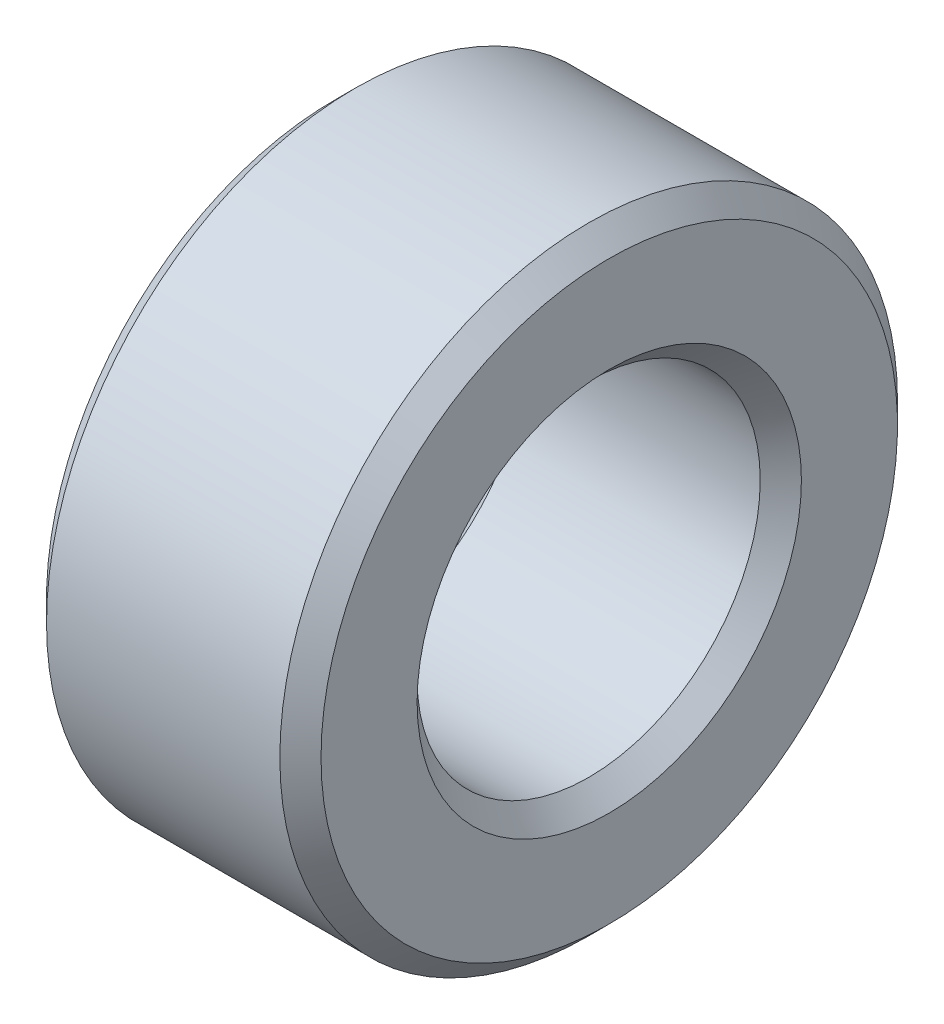
ISO-10303-21;
HEADER;
FILE_DESCRIPTION(('STEP AP214'),'2;1');
FILE_NAME('part.step','',(''),(''),'','','');
FILE_SCHEMA(('AUTOMOTIVE_DESIGN { 1 0 10303 214 1 1 1 1 }'));
ENDSEC;
DATA;
#1=APPLICATION_CONTEXT('core data for automotive mechanical design processes');
#2=APPLICATION_PROTOCOL_DEFINITION('international standard','automotive_design',2000,#1);
#3=PRODUCT_CONTEXT('',#1,'mechanical');
#4=PRODUCT('Part','Part','',(#3));
#5=PRODUCT_RELATED_PRODUCT_CATEGORY('part','',(#4));
#6=PRODUCT_DEFINITION_FORMATION('','',#4);
#7=PRODUCT_DEFINITION_CONTEXT('part definition',#1,'design');
#8=PRODUCT_DEFINITION('design','',#6,#7);
#9=PRODUCT_DEFINITION_SHAPE('','',#8);
#10=(LENGTH_UNIT() NAMED_UNIT(*) SI_UNIT(.MILLI.,.METRE.));
#11=(NAMED_UNIT(*) PLANE_ANGLE_UNIT() SI_UNIT($,.RADIAN.));
#12=(NAMED_UNIT(*) SI_UNIT($,.STERADIAN.) SOLID_ANGLE_UNIT());
#13=UNCERTAINTY_MEASURE_WITH_UNIT(LENGTH_MEASURE(1.E-05),#10,'distance_accuracy_value','');
#14=(GEOMETRIC_REPRESENTATION_CONTEXT(3) GLOBAL_UNCERTAINTY_ASSIGNED_CONTEXT((#13)) GLOBAL_UNIT_ASSIGNED_CONTEXT((#10,
#11,#12)) REPRESENTATION_CONTEXT('',''));
#15=CARTESIAN_POINT('',(0.,0.,0.));
#16=DIRECTION('',(0.,0.,1.));
#17=DIRECTION('',(1.,0.,0.));
#18=AXIS2_PLACEMENT_3D('',#15,#16,#17);
#19=CARTESIAN_POINT('',(0.,4.49999999999999,0.));
#20=DIRECTION('',(1.,0.,0.));
#21=DIRECTION('',(0.,0.,-1.));
#22=AXIS2_PLACEMENT_3D('',#19,#20,#21);
#23=PLANE('',#22);
#24=CARTESIAN_POINT('',(0.,0.,0.));
#25=DIRECTION('',(1.,0.,0.));
#26=DIRECTION('',(0.,0.,-1.));
#27=AXIS2_PLACEMENT_3D('',#24,#25,#26);
#28=CIRCLE('',#27,4.2);
#29=CARTESIAN_POINT('',(0.,0.,-4.2));
#30=VERTEX_POINT('',#29);
#31=EDGE_CURVE('E10',#30,#30,#28,.F.);
#32=ORIENTED_EDGE('',*,*,#31,.T.);
#33=EDGE_LOOP('',(#32));
#34=FACE_BOUND('',#33,.T.);
#35=CARTESIAN_POINT('',(0.,0.,0.));
#36=DIRECTION('',(1.,0.,0.));
#37=DIRECTION('',(0.,0.,-1.));
#38=AXIS2_PLACEMENT_3D('',#35,#36,#37);
#39=CIRCLE('',#38,2.8);
#40=CARTESIAN_POINT('',(0.,0.,2.8));
#41=VERTEX_POINT('',#40);
#42=EDGE_CURVE('E33',#41,#41,#39,.T.);
#43=ORIENTED_EDGE('',*,*,#42,.T.);
#44=EDGE_LOOP('',(#43));
#45=FACE_BOUND('',#44,.T.);
#46=ADVANCED_FACE('F27',(#34,#45),#23,.F.);
#47=CARTESIAN_POINT('',(0.,0.,0.));
#48=DIRECTION('',(-1.,0.,0.));
#49=DIRECTION('',(0.,0.,1.));
#50=AXIS2_PLACEMENT_3D('',#47,#48,#49);
#51=CYLINDRICAL_SURFACE('',#50,2.5);
#52=CARTESIAN_POINT('',(3.7,0.,0.));
#53=DIRECTION('',(-1.,0.,0.));
#54=DIRECTION('',(0.,0.,1.));
#55=AXIS2_PLACEMENT_3D('',#52,#53,#54);
#56=CIRCLE('',#55,2.5);
#57=CARTESIAN_POINT('',(3.7,0.,2.5));
#58=VERTEX_POINT('',#57);
#59=EDGE_CURVE('E46',#58,#58,#56,.F.);
#60=ORIENTED_EDGE('',*,*,#59,.T.);
#61=EDGE_LOOP('',(#60));
#62=FACE_BOUND('',#61,.T.);
#63=CARTESIAN_POINT('',(0.3,0.,0.));
#64=DIRECTION('',(1.,0.,0.));
#65=DIRECTION('',(0.,0.,-1.));
#66=AXIS2_PLACEMENT_3D('',#63,#64,#65);
#67=CIRCLE('',#66,2.5);
#68=CARTESIAN_POINT('',(0.3,0.,2.5));
#69=VERTEX_POINT('',#68);
#70=EDGE_CURVE('E49',#69,#69,#67,.F.);
#71=ORIENTED_EDGE('',*,*,#70,.T.);
#72=EDGE_LOOP('',(#71));
#73=FACE_BOUND('',#72,.T.);
#74=ADVANCED_FACE('F85',(#62,#73),#51,.F.);
#75=CARTESIAN_POINT('',(4.,2.5,0.));
#76=DIRECTION('',(-1.,0.,0.));
#77=DIRECTION('',(0.,0.,1.));
#78=AXIS2_PLACEMENT_3D('',#75,#76,#77);
#79=PLANE('',#78);
#80=CARTESIAN_POINT('',(4.,0.,0.));
#81=DIRECTION('',(-1.,0.,0.));
#82=DIRECTION('',(0.,0.,1.));
#83=AXIS2_PLACEMENT_3D('',#80,#81,#82);
#84=CIRCLE('',#83,2.8);
#85=CARTESIAN_POINT('',(4.,0.,2.8));
#86=VERTEX_POINT('',#85);
#87=EDGE_CURVE('E52',#86,#86,#84,.T.);
#88=ORIENTED_EDGE('',*,*,#87,.T.);
#89=EDGE_LOOP('',(#88));
#90=FACE_BOUND('',#89,.T.);
#91=CARTESIAN_POINT('',(4.,0.,0.));
#92=DIRECTION('',(-1.,0.,0.));
#93=DIRECTION('',(0.,0.,1.));
#94=AXIS2_PLACEMENT_3D('',#91,#92,#93);
#95=CIRCLE('',#94,4.19999999999999);
#96=CARTESIAN_POINT('',(4.,0.,4.19999999999999));
#97=VERTEX_POINT('',#96);
#98=EDGE_CURVE('E55',#97,#97,#95,.F.);
#99=ORIENTED_EDGE('',*,*,#98,.T.);
#100=EDGE_LOOP('',(#99));
#101=FACE_BOUND('',#100,.T.);
#102=ADVANCED_FACE('F59',(#90,#101),#79,.F.);
#103=CARTESIAN_POINT('',(0.,0.,0.));
#104=DIRECTION('',(-1.,0.,0.));
#105=DIRECTION('',(0.,0.,1.));
#106=AXIS2_PLACEMENT_3D('',#103,#104,#105);
#107=CYLINDRICAL_SURFACE('',#106,4.49999999999999);
#108=CARTESIAN_POINT('',(3.7,0.,0.));
#109=DIRECTION('',(-1.,0.,0.));
#110=DIRECTION('',(0.,0.,1.));
#111=AXIS2_PLACEMENT_3D('',#108,#109,#110);
#112=CIRCLE('',#111,4.49999999999999);
#113=CARTESIAN_POINT('',(3.7,0.,4.49999999999999));
#114=VERTEX_POINT('',#113);
#115=EDGE_CURVE('E37',#114,#114,#112,.T.);
#116=CARTESIAN_POINT('',(0.300000000000002,0.,0.));
#117=DIRECTION('',(1.,0.,0.));
#118=DIRECTION('',(0.,0.,-1.));
#119=AXIS2_PLACEMENT_3D('',#116,#117,#118);
#120=CIRCLE('',#119,4.49999999999999);
#121=CARTESIAN_POINT('',(0.300000000000002,0.,4.49999999999999));
#122=VERTEX_POINT('',#121);
#123=EDGE_CURVE('E41',#122,#122,#120,.T.);
#124=CARTESIAN_POINT('',(3.7,0.,4.49999999999999));
#125=CARTESIAN_POINT('',(3.66458333333334,0.,4.49999999999999));
#126=CARTESIAN_POINT('',(3.62916666666667,0.,4.49999999999999));
#127=CARTESIAN_POINT('',(3.55833333333334,0.,4.49999999999999));
#128=CARTESIAN_POINT('',(3.52291666666667,0.,4.49999999999999));
#129=CARTESIAN_POINT('',(3.45208333333334,0.,4.49999999999999));
#130=CARTESIAN_POINT('',(3.41666666666667,0.,4.49999999999999));
#131=CARTESIAN_POINT('',(3.34583333333334,0.,4.49999999999999));
#132=CARTESIAN_POINT('',(3.31041666666667,0.,4.49999999999999));
#133=CARTESIAN_POINT('',(3.23958333333334,0.,4.49999999999999));
#134=CARTESIAN_POINT('',(3.20416666666667,0.,4.49999999999999));
#135=CARTESIAN_POINT('',(3.13333333333334,0.,4.49999999999999));
#136=CARTESIAN_POINT('',(3.09791666666667,0.,4.49999999999999));
#137=CARTESIAN_POINT('',(3.02708333333334,0.,4.49999999999999));
#138=CARTESIAN_POINT('',(2.99166666666667,0.,4.49999999999999));
#139=CARTESIAN_POINT('',(2.92083333333334,0.,4.49999999999999));
#140=CARTESIAN_POINT('',(2.88541666666667,0.,4.49999999999999));
#141=CARTESIAN_POINT('',(2.81458333333334,0.,4.49999999999999));
#142=CARTESIAN_POINT('',(2.77916666666667,0.,4.49999999999999));
#143=CARTESIAN_POINT('',(2.70833333333334,0.,4.49999999999999));
#144=CARTESIAN_POINT('',(2.67291666666667,0.,4.49999999999999));
#145=CARTESIAN_POINT('',(2.60208333333334,0.,4.49999999999999));
#146=CARTESIAN_POINT('',(2.56666666666667,0.,4.49999999999999));
#147=CARTESIAN_POINT('',(2.49583333333334,0.,4.49999999999999));
#148=CARTESIAN_POINT('',(2.46041666666667,0.,4.49999999999999));
#149=CARTESIAN_POINT('',(2.38958333333334,0.,4.49999999999999));
#150=CARTESIAN_POINT('',(2.35416666666667,0.,4.49999999999999));
#151=CARTESIAN_POINT('',(2.28333333333334,0.,4.49999999999999));
#152=CARTESIAN_POINT('',(2.24791666666667,0.,4.49999999999999));
#153=CARTESIAN_POINT('',(2.17708333333334,0.,4.49999999999999));
#154=CARTESIAN_POINT('',(2.14166666666667,0.,4.49999999999999));
#155=CARTESIAN_POINT('',(2.07083333333334,0.,4.49999999999999));
#156=CARTESIAN_POINT('',(2.03541666666667,0.,4.49999999999999));
#157=CARTESIAN_POINT('',(1.96458333333334,0.,4.49999999999999));
#158=CARTESIAN_POINT('',(1.92916666666667,0.,4.49999999999999));
#159=CARTESIAN_POINT('',(1.85833333333334,0.,4.49999999999999));
#160=CARTESIAN_POINT('',(1.82291666666667,0.,4.49999999999999));
#161=CARTESIAN_POINT('',(1.75208333333334,0.,4.49999999999999));
#162=CARTESIAN_POINT('',(1.71666666666667,0.,4.49999999999999));
#163=CARTESIAN_POINT('',(1.64583333333334,0.,4.49999999999999));
#164=CARTESIAN_POINT('',(1.61041666666667,0.,4.49999999999999));
#165=CARTESIAN_POINT('',(1.53958333333334,0.,4.49999999999999));
#166=CARTESIAN_POINT('',(1.50416666666667,0.,4.49999999999999));
#167=CARTESIAN_POINT('',(1.43333333333334,0.,4.49999999999999));
#168=CARTESIAN_POINT('',(1.39791666666667,0.,4.49999999999999));
#169=CARTESIAN_POINT('',(1.32708333333334,0.,4.49999999999999));
#170=CARTESIAN_POINT('',(1.29166666666667,0.,4.49999999999999));
#171=CARTESIAN_POINT('',(1.22083333333334,0.,4.49999999999999));
#172=CARTESIAN_POINT('',(1.18541666666667,0.,4.49999999999999));
#173=CARTESIAN_POINT('',(1.11458333333334,0.,4.49999999999999));
#174=CARTESIAN_POINT('',(1.07916666666667,0.,4.49999999999999));
#175=CARTESIAN_POINT('',(1.00833333333334,0.,4.49999999999999));
#176=CARTESIAN_POINT('',(0.972916666666669,0.,4.49999999999999));
#177=CARTESIAN_POINT('',(0.902083333333336,0.,4.49999999999999));
#178=CARTESIAN_POINT('',(0.866666666666669,0.,4.49999999999999));
#179=CARTESIAN_POINT('',(0.795833333333336,0.,4.49999999999999));
#180=CARTESIAN_POINT('',(0.760416666666669,0.,4.49999999999999));
#181=CARTESIAN_POINT('',(0.689583333333336,0.,4.49999999999999));
#182=CARTESIAN_POINT('',(0.654166666666669,0.,4.49999999999999));
#183=CARTESIAN_POINT('',(0.583333333333336,0.,4.49999999999999));
#184=CARTESIAN_POINT('',(0.547916666666669,0.,4.49999999999999));
#185=CARTESIAN_POINT('',(0.477083333333336,0.,4.49999999999999));
#186=CARTESIAN_POINT('',(0.441666666666669,0.,4.49999999999999));
#187=CARTESIAN_POINT('',(0.370833333333336,0.,4.49999999999999));
#188=CARTESIAN_POINT('',(0.335416666666669,0.,4.49999999999999));
#189=CARTESIAN_POINT('',(0.300000000000003,0.,4.49999999999999));
#190=B_SPLINE_CURVE_WITH_KNOTS('',3,(#124,#125,#126,#127,#128,#129,#130,#131,#132,#133,#134,
#135,#136,#137,#138,#139,#140,#141,#142,#143,#144,#145,#146,#147,#148,#149,#150,#151,#152,#153,
#154,#155,#156,#157,#158,#159,#160,#161,#162,#163,#164,#165,#166,#167,#168,#169,#170,#171,#172,
#173,#174,#175,#176,#177,#178,#179,#180,#181,#182,#183,#184,#185,#186,#187,#188,#189),
.UNSPECIFIED.,.F.,.F.,(4,2,2,2,2,2,2,2,2,2,2,2,2,2,2,2,2,2,2,2,2,2,2,2,2,2,2,2,2,2,2,2,4),(0.,
0.10625,0.2125,0.31875,0.425,0.53125,0.6375,0.74375,0.85,0.95625,1.0625,1.16875,1.275,1.38125,
1.4875,1.59375,1.7,1.80625,1.9125,2.01875,2.125,2.23125,2.3375,2.44375,2.55,2.65625,2.7625,
2.86875,2.975,3.08125,3.1875,3.29375,3.4),.UNSPECIFIED.);
#191=EDGE_CURVE('BSEAM69',#114,#122,#190,.T.);
#192=ORIENTED_EDGE('',*,*,#115,.T.);
#193=ORIENTED_EDGE('',*,*,#123,.T.);
#194=ORIENTED_EDGE('',*,*,#191,.T.);
#195=ORIENTED_EDGE('',*,*,#191,.F.);
#196=EDGE_LOOP('',(#192,#194,#193,#195));
#197=FACE_BOUND('',#196,.T.);
#198=ADVANCED_FACE('F69',(#197),#107,.T.);
#199=CARTESIAN_POINT('',(4.,0.,0.));
#200=DIRECTION('',(1.,0.,0.));
#201=DIRECTION('',(0.,0.,-1.));
#202=AXIS2_PLACEMENT_3D('',#199,#200,#201);
#203=CONICAL_SURFACE('',#202,2.8,0.785398163397448);
#204=ORIENTED_EDGE('',*,*,#59,.F.);
#205=EDGE_LOOP('',(#204));
#206=FACE_BOUND('',#205,.T.);
#207=ORIENTED_EDGE('',*,*,#87,.F.);
#208=EDGE_LOOP('',(#207));
#209=FACE_BOUND('',#208,.T.);
#210=ADVANCED_FACE('F65',(#206,#209),#203,.F.);
#211=CARTESIAN_POINT('',(3.7,0.,0.));
#212=DIRECTION('',(-1.,0.,0.));
#213=DIRECTION('',(0.,0.,1.));
#214=AXIS2_PLACEMENT_3D('',#211,#212,#213);
#215=CONICAL_SURFACE('',#214,4.49999999999999,0.78539816339745);
#216=CARTESIAN_POINT('',(4.,0.,4.19999999999999));
#217=CARTESIAN_POINT('',(3.996875,0.,4.20312499999999));
#218=CARTESIAN_POINT('',(3.99375,0.,4.20624999999999));
#219=CARTESIAN_POINT('',(3.9875,0.,4.21249999999999));
#220=CARTESIAN_POINT('',(3.984375,0.,4.21562499999999));
#221=CARTESIAN_POINT('',(3.978125,0.,4.22187499999999));
#222=CARTESIAN_POINT('',(3.975,0.,4.22499999999999));
#223=CARTESIAN_POINT('',(3.96875,0.,4.23124999999999));
#224=CARTESIAN_POINT('',(3.965625,0.,4.23437499999999));
#225=CARTESIAN_POINT('',(3.959375,0.,4.24062499999999));
#226=CARTESIAN_POINT('',(3.95625,0.,4.24374999999999));
#227=CARTESIAN_POINT('',(3.95,0.,4.24999999999999));
#228=CARTESIAN_POINT('',(3.946875,0.,4.25312499999999));
#229=CARTESIAN_POINT('',(3.940625,0.,4.25937499999999));
#230=CARTESIAN_POINT('',(3.9375,0.,4.26249999999999));
#231=CARTESIAN_POINT('',(3.93125,0.,4.26874999999999));
#232=CARTESIAN_POINT('',(3.928125,0.,4.27187499999999));
#233=CARTESIAN_POINT('',(3.921875,0.,4.27812499999999));
#234=CARTESIAN_POINT('',(3.91875,0.,4.28124999999999));
#235=CARTESIAN_POINT('',(3.9125,0.,4.28749999999999));
#236=CARTESIAN_POINT('',(3.909375,0.,4.29062499999999));
#237=CARTESIAN_POINT('',(3.903125,0.,4.29687499999999));
#238=CARTESIAN_POINT('',(3.9,0.,4.29999999999999));
#239=CARTESIAN_POINT('',(3.89375,0.,4.30624999999999));
#240=CARTESIAN_POINT('',(3.890625,0.,4.30937499999999));
#241=CARTESIAN_POINT('',(3.884375,0.,4.31562499999999));
#242=CARTESIAN_POINT('',(3.88125,0.,4.31874999999999));
#243=CARTESIAN_POINT('',(3.875,0.,4.32499999999999));
#244=CARTESIAN_POINT('',(3.871875,0.,4.32812499999999));
#245=CARTESIAN_POINT('',(3.865625,0.,4.33437499999999));
#246=CARTESIAN_POINT('',(3.8625,0.,4.33749999999999));
#247=CARTESIAN_POINT('',(3.85625,0.,4.34374999999999));
#248=CARTESIAN_POINT('',(3.853125,0.,4.34687499999999));
#249=CARTESIAN_POINT('',(3.846875,0.,4.35312499999999));
#250=CARTESIAN_POINT('',(3.84375,0.,4.35624999999999));
#251=CARTESIAN_POINT('',(3.8375,0.,4.36249999999999));
#252=CARTESIAN_POINT('',(3.834375,0.,4.36562499999999));
#253=CARTESIAN_POINT('',(3.828125,0.,4.37187499999999));
#254=CARTESIAN_POINT('',(3.825,0.,4.37499999999999));
#255=CARTESIAN_POINT('',(3.81875,0.,4.38124999999999));
#256=CARTESIAN_POINT('',(3.815625,0.,4.38437499999999));
#257=CARTESIAN_POINT('',(3.809375,0.,4.39062499999999));
#258=CARTESIAN_POINT('',(3.80625,0.,4.39374999999999));
#259=CARTESIAN_POINT('',(3.8,0.,4.39999999999999));
#260=CARTESIAN_POINT('',(3.796875,0.,4.40312499999999));
#261=CARTESIAN_POINT('',(3.790625,0.,4.40937499999999));
#262=CARTESIAN_POINT('',(3.7875,0.,4.41249999999999));
#263=CARTESIAN_POINT('',(3.78125,0.,4.41874999999999));
#264=CARTESIAN_POINT('',(3.778125,0.,4.42187499999999));
#265=CARTESIAN_POINT('',(3.771875,0.,4.42812499999999));
#266=CARTESIAN_POINT('',(3.76875,0.,4.43124999999999));
#267=CARTESIAN_POINT('',(3.7625,0.,4.43749999999999));
#268=CARTESIAN_POINT('',(3.759375,0.,4.44062499999999));
#269=CARTESIAN_POINT('',(3.753125,0.,4.44687499999999));
#270=CARTESIAN_POINT('',(3.75,0.,4.44999999999999));
#271=CARTESIAN_POINT('',(3.74375,0.,4.45624999999999));
#272=CARTESIAN_POINT('',(3.740625,0.,4.45937499999999));
#273=CARTESIAN_POINT('',(3.734375,0.,4.46562499999999));
#274=CARTESIAN_POINT('',(3.73125,0.,4.46874999999999));
#275=CARTESIAN_POINT('',(3.725,0.,4.47499999999999));
#276=CARTESIAN_POINT('',(3.721875,0.,4.47812499999999));
#277=CARTESIAN_POINT('',(3.715625,0.,4.48437499999999));
#278=CARTESIAN_POINT('',(3.7125,0.,4.48749999999999));
#279=CARTESIAN_POINT('',(3.70625,0.,4.49374999999999));
#280=CARTESIAN_POINT('',(3.703125,0.,4.49687499999999));
#281=CARTESIAN_POINT('',(3.7,0.,4.49999999999999));
#282=B_SPLINE_CURVE_WITH_KNOTS('',3,(#216,#217,#218,#219,#220,#221,#222,#223,#224,#225,#226,
#227,#228,#229,#230,#231,#232,#233,#234,#235,#236,#237,#238,#239,#240,#241,#242,#243,#244,#245,
#246,#247,#248,#249,#250,#251,#252,#253,#254,#255,#256,#257,#258,#259,#260,#261,#262,#263,#264,
#265,#266,#267,#268,#269,#270,#271,#272,#273,#274,#275,#276,#277,#278,#279,#280,#281),
.UNSPECIFIED.,.F.,.F.,(4,2,2,2,2,2,2,2,2,2,2,2,2,2,2,2,2,2,2,2,2,2,2,2,2,2,2,2,2,2,2,2,4),(0.,
0.0132582521472488,0.0265165042944963,0.0397747564417438,0.0530330085889914,0.0662912607362401,
0.0795495128834876,0.0928077650307352,0.106066017177983,0.119324269325231,0.132582521472479,
0.145840773619727,0.159099025766974,0.172357277914223,0.18561553006147,0.198873782208718,
0.212132034355966,0.225390286503214,0.238648538650461,0.251906790797709,0.265165042944957,
0.278423295092205,0.291681547239453,0.3049397993867,0.318198051533949,0.331456303681196,
0.344714555828444,0.357972807975692,0.37123106012294,0.384489312270188,0.397747564417435,
0.411005816564683,0.424264068711931),.UNSPECIFIED.);
#283=EDGE_CURVE('BSEAM61',#97,#114,#282,.T.);
#284=ORIENTED_EDGE('',*,*,#98,.F.);
#285=ORIENTED_EDGE('',*,*,#115,.F.);
#286=ORIENTED_EDGE('',*,*,#283,.T.);
#287=ORIENTED_EDGE('',*,*,#283,.F.);
#288=EDGE_LOOP('',(#284,#286,#285,#287));
#289=FACE_BOUND('',#288,.T.);
#290=ADVANCED_FACE('F61',(#289),#215,.T.);
#291=CARTESIAN_POINT('',(0.,0.,0.));
#292=DIRECTION('',(1.,0.,0.));
#293=DIRECTION('',(0.,0.,-1.));
#294=AXIS2_PLACEMENT_3D('',#291,#292,#293);
#295=CONICAL_SURFACE('',#294,4.2,0.785398163397444);
#296=ORIENTED_EDGE('',*,*,#123,.F.);
#297=EDGE_LOOP('',(#296));
#298=FACE_BOUND('',#297,.T.);
#299=ORIENTED_EDGE('',*,*,#31,.F.);
#300=EDGE_LOOP('',(#299));
#301=FACE_BOUND('',#300,.T.);
#302=ADVANCED_FACE('F64',(#298,#301),#295,.T.);
#303=CARTESIAN_POINT('',(0.3,0.,0.));
#304=DIRECTION('',(-1.,0.,0.));
#305=DIRECTION('',(0.,0.,1.));
#306=AXIS2_PLACEMENT_3D('',#303,#304,#305);
#307=CONICAL_SURFACE('',#306,2.5,0.785398163397449);
#308=CARTESIAN_POINT('',(0.,0.,2.8));
#309=CARTESIAN_POINT('',(0.00312500000000144,0.,2.796875));
#310=CARTESIAN_POINT('',(0.00625000000000145,0.,2.79375));
#311=CARTESIAN_POINT('',(0.0125000000000015,0.,2.7875));
#312=CARTESIAN_POINT('',(0.0156250000000015,0.,2.784375));
#313=CARTESIAN_POINT('',(0.0218750000000015,0.,2.778125));
#314=CARTESIAN_POINT('',(0.0250000000000014,0.,2.775));
#315=CARTESIAN_POINT('',(0.0312500000000013,0.,2.76875));
#316=CARTESIAN_POINT('',(0.0343750000000013,0.,2.765625));
#317=CARTESIAN_POINT('',(0.0406250000000013,0.,2.759375));
#318=CARTESIAN_POINT('',(0.0437500000000014,0.,2.75625));
#319=CARTESIAN_POINT('',(0.0500000000000013,0.,2.75));
#320=CARTESIAN_POINT('',(0.0531250000000012,0.,2.746875));
#321=CARTESIAN_POINT('',(0.0593750000000012,0.,2.740625));
#322=CARTESIAN_POINT('',(0.0625000000000012,0.,2.7375));
#323=CARTESIAN_POINT('',(0.0687500000000012,0.,2.73125));
#324=CARTESIAN_POINT('',(0.0718750000000012,0.,2.728125));
#325=CARTESIAN_POINT('',(0.0781250000000012,0.,2.721875));
#326=CARTESIAN_POINT('',(0.0812500000000011,0.,2.71875));
#327=CARTESIAN_POINT('',(0.0875000000000011,0.,2.7125));
#328=CARTESIAN_POINT('',(0.0906250000000011,0.,2.709375));
#329=CARTESIAN_POINT('',(0.0968750000000011,0.,2.703125));
#330=CARTESIAN_POINT('',(0.100000000000001,0.,2.7));
#331=CARTESIAN_POINT('',(0.106250000000001,0.,2.69375));
#332=CARTESIAN_POINT('',(0.109375000000001,0.,2.690625));
#333=CARTESIAN_POINT('',(0.115625000000001,0.,2.684375));
#334=CARTESIAN_POINT('',(0.118750000000001,0.,2.68125));
#335=CARTESIAN_POINT('',(0.125000000000001,0.,2.675));
#336=CARTESIAN_POINT('',(0.128125000000001,0.,2.671875));
#337=CARTESIAN_POINT('',(0.134375000000001,0.,2.665625));
#338=CARTESIAN_POINT('',(0.137500000000001,0.,2.6625));
#339=CARTESIAN_POINT('',(0.143750000000001,0.,2.65625));
#340=CARTESIAN_POINT('',(0.146875000000001,0.,2.653125));
#341=CARTESIAN_POINT('',(0.153125000000001,0.,2.646875));
#342=CARTESIAN_POINT('',(0.156250000000001,0.,2.64375));
#343=CARTESIAN_POINT('',(0.162500000000001,0.,2.6375));
#344=CARTESIAN_POINT('',(0.165625000000001,0.,2.634375));
#345=CARTESIAN_POINT('',(0.171875000000001,0.,2.628125));
#346=CARTESIAN_POINT('',(0.175000000000001,0.,2.625));
#347=CARTESIAN_POINT('',(0.181250000000001,0.,2.61875));
#348=CARTESIAN_POINT('',(0.184375000000001,0.,2.615625));
#349=CARTESIAN_POINT('',(0.190625000000001,0.,2.609375));
#350=CARTESIAN_POINT('',(0.193750000000001,0.,2.60625));
#351=CARTESIAN_POINT('',(0.200000000000001,0.,2.6));
#352=CARTESIAN_POINT('',(0.203125000000001,0.,2.596875));
#353=CARTESIAN_POINT('',(0.209375000000001,0.,2.590625));
#354=CARTESIAN_POINT('',(0.212500000000001,0.,2.5875));
#355=CARTESIAN_POINT('',(0.218750000000001,0.,2.58125));
#356=CARTESIAN_POINT('',(0.221875000000001,0.,2.578125));
#357=CARTESIAN_POINT('',(0.228125,0.,2.571875));
#358=CARTESIAN_POINT('',(0.23125,0.,2.56875));
#359=CARTESIAN_POINT('',(0.2375,0.,2.5625));
#360=CARTESIAN_POINT('',(0.240625,0.,2.559375));
#361=CARTESIAN_POINT('',(0.246875,0.,2.553125));
#362=CARTESIAN_POINT('',(0.25,0.,2.55));
#363=CARTESIAN_POINT('',(0.25625,0.,2.54375));
#364=CARTESIAN_POINT('',(0.259375,0.,2.540625));
#365=CARTESIAN_POINT('',(0.265625,0.,2.534375));
#366=CARTESIAN_POINT('',(0.26875,0.,2.53125));
#367=CARTESIAN_POINT('',(0.275,0.,2.525));
#368=CARTESIAN_POINT('',(0.278125,0.,2.521875));
#369=CARTESIAN_POINT('',(0.284375,0.,2.515625));
#370=CARTESIAN_POINT('',(0.2875,0.,2.5125));
#371=CARTESIAN_POINT('',(0.29375,0.,2.50625));
#372=CARTESIAN_POINT('',(0.296875,0.,2.503125));
#373=CARTESIAN_POINT('',(0.3,0.,2.5));
#374=B_SPLINE_CURVE_WITH_KNOTS('',3,(#308,#309,#310,#311,#312,#313,#314,#315,#316,#317,#318,
#319,#320,#321,#322,#323,#324,#325,#326,#327,#328,#329,#330,#331,#332,#333,#334,#335,#336,#337,
#338,#339,#340,#341,#342,#343,#344,#345,#346,#347,#348,#349,#350,#351,#352,#353,#354,#355,#356,
#357,#358,#359,#360,#361,#362,#363,#364,#365,#366,#367,#368,#369,#370,#371,#372,#373),
.UNSPECIFIED.,.F.,.F.,(4,2,2,2,2,2,2,2,2,2,2,2,2,2,2,2,2,2,2,2,2,2,2,2,2,2,2,2,2,2,2,2,4),(0.,
0.0132582521472476,0.0265165042944953,0.0397747564417432,0.0530330085889908,0.0662912607362384,
0.0795495128834863,0.0928077650307339,0.106066017177982,0.119324269325229,0.132582521472477,
0.145840773619725,0.159099025766973,0.17235727791422,0.185615530061468,0.198873782208716,
0.212132034355963,0.225390286503211,0.238648538650459,0.251906790797707,0.265165042944954,
0.278423295092202,0.29168154723945,0.304939799386697,0.318198051533945,0.331456303681193,
0.344714555828441,0.357972807975688,0.371231060122936,0.384489312270184,0.397747564417431,
0.411005816564679,0.424264068711927),.UNSPECIFIED.);
#375=EDGE_CURVE('BSEAM77',#41,#69,#374,.T.);
#376=ORIENTED_EDGE('',*,*,#42,.F.);
#377=ORIENTED_EDGE('',*,*,#70,.F.);
#378=ORIENTED_EDGE('',*,*,#375,.T.);
#379=ORIENTED_EDGE('',*,*,#375,.F.);
#380=EDGE_LOOP('',(#376,#378,#377,#379));
#381=FACE_BOUND('',#380,.T.);
#382=ADVANCED_FACE('F77',(#381),#307,.F.);
#383=CLOSED_SHELL('',(#46,#74,#102,#198,#210,#290,#302,#382));
#384=MANIFOLD_SOLID_BREP('B2',#383);
#385=ADVANCED_BREP_SHAPE_REPRESENTATION('',(#18,#384),#14);
#386=SHAPE_DEFINITION_REPRESENTATION(#9,#385);
ENDSEC;
END-ISO-10303-21;
